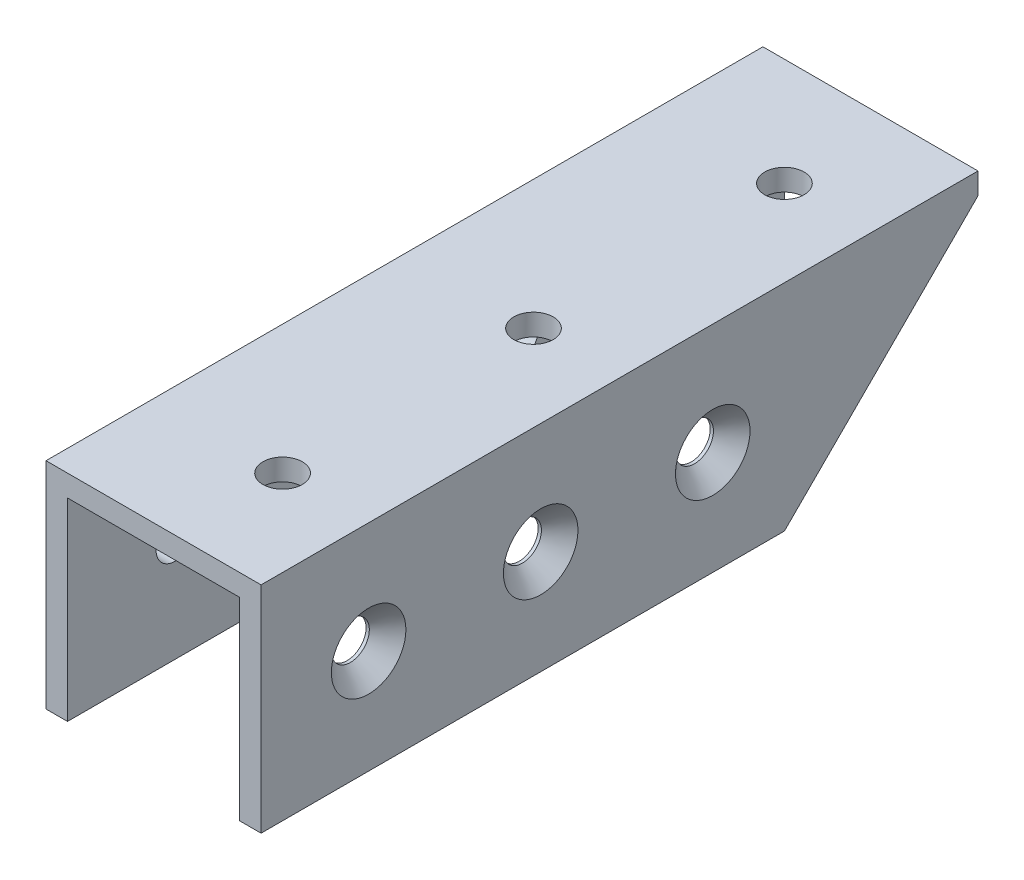
ISO-10303-21;
HEADER;
FILE_DESCRIPTION(('STEP AP214'),'2;1');
FILE_NAME('part.step','',(''),(''),'','','');
FILE_SCHEMA(('AUTOMOTIVE_DESIGN { 1 0 10303 214 1 1 1 1 }'));
ENDSEC;
DATA;
#1=APPLICATION_CONTEXT('core data for automotive mechanical design processes');
#2=APPLICATION_PROTOCOL_DEFINITION('international standard','automotive_design',2000,#1);
#3=PRODUCT_CONTEXT('',#1,'mechanical');
#4=PRODUCT('Part','Part','',(#3));
#5=PRODUCT_RELATED_PRODUCT_CATEGORY('part','',(#4));
#6=PRODUCT_DEFINITION_FORMATION('','',#4);
#7=PRODUCT_DEFINITION_CONTEXT('part definition',#1,'design');
#8=PRODUCT_DEFINITION('design','',#6,#7);
#9=PRODUCT_DEFINITION_SHAPE('','',#8);
#10=(LENGTH_UNIT() NAMED_UNIT(*) SI_UNIT(.MILLI.,.METRE.));
#11=(NAMED_UNIT(*) PLANE_ANGLE_UNIT() SI_UNIT($,.RADIAN.));
#12=(NAMED_UNIT(*) SI_UNIT($,.STERADIAN.) SOLID_ANGLE_UNIT());
#13=UNCERTAINTY_MEASURE_WITH_UNIT(LENGTH_MEASURE(1.E-05),#10,'distance_accuracy_value','');
#14=(GEOMETRIC_REPRESENTATION_CONTEXT(3) GLOBAL_UNCERTAINTY_ASSIGNED_CONTEXT((#13)) GLOBAL_UNIT_ASSIGNED_CONTEXT((#10,
#11,#12)) REPRESENTATION_CONTEXT('',''));
#15=CARTESIAN_POINT('',(0.,0.,0.));
#16=DIRECTION('',(0.,0.,1.));
#17=DIRECTION('',(1.,0.,0.));
#18=AXIS2_PLACEMENT_3D('',#15,#16,#17);
#19=CARTESIAN_POINT('',(3.,0.,100.));
#20=DIRECTION('',(0.,1.,0.));
#21=DIRECTION('',(-1.,0.,0.));
#22=AXIS2_PLACEMENT_3D('',#19,#20,#21);
#23=PLANE('',#22);
#24=DIRECTION('',(1.,0.,0.));
#25=VECTOR('',#24,1.);
#26=CARTESIAN_POINT('',(3.,0.,0.));
#27=LINE('',#26,#25);
#28=CARTESIAN_POINT('',(0.,0.,0.));
#29=VERTEX_POINT('',#28);
#30=CARTESIAN_POINT('',(3.,0.,0.));
#31=VERTEX_POINT('',#30);
#32=EDGE_CURVE('E128',#29,#31,#27,.T.);
#33=ORIENTED_EDGE('',*,*,#32,.T.);
#34=DIRECTION('',(0.,0.,-1.));
#35=VECTOR('',#34,1.);
#36=CARTESIAN_POINT('',(3.,0.,100.));
#37=LINE('',#36,#35);
#38=CARTESIAN_POINT('',(3.,0.,100.));
#39=VERTEX_POINT('',#38);
#40=EDGE_CURVE('E109',#39,#31,#37,.T.);
#41=ORIENTED_EDGE('',*,*,#40,.F.);
#42=DIRECTION('',(1.,0.,0.));
#43=VECTOR('',#42,1.);
#44=CARTESIAN_POINT('',(3.,0.,100.));
#45=LINE('',#44,#43);
#46=CARTESIAN_POINT('',(0.,0.,100.));
#47=VERTEX_POINT('',#46);
#48=EDGE_CURVE('E116',#47,#39,#45,.T.);
#49=ORIENTED_EDGE('',*,*,#48,.F.);
#50=DIRECTION('',(0.,0.,-1.));
#51=VECTOR('',#50,1.);
#52=CARTESIAN_POINT('',(0.,0.,100.));
#53=LINE('',#52,#51);
#54=EDGE_CURVE('E174',#47,#29,#53,.T.);
#55=ORIENTED_EDGE('',*,*,#54,.T.);
#56=EDGE_LOOP('',(#33,#41,#49,#55));
#57=FACE_BOUND('',#56,.T.);
#58=ADVANCED_FACE('F36',(#57),#23,.F.);
#59=CARTESIAN_POINT('',(3.,27.,100.));
#60=DIRECTION('',(-1.,0.,0.));
#61=DIRECTION('',(0.,-1.,0.));
#62=AXIS2_PLACEMENT_3D('',#59,#60,#61);
#63=PLANE('',#62);
#64=CARTESIAN_POINT('',(3.,14.5,37.));
#65=DIRECTION('',(-1.,0.,0.));
#66=DIRECTION('',(0.,-1.,0.));
#67=AXIS2_PLACEMENT_3D('',#64,#65,#66);
#68=CIRCLE('',#67,2.64999999999999);
#69=CARTESIAN_POINT('',(3.,11.85,37.));
#70=VERTEX_POINT('',#69);
#71=EDGE_CURVE('E238',#70,#70,#68,.T.);
#72=ORIENTED_EDGE('',*,*,#71,.T.);
#73=EDGE_LOOP('',(#72));
#74=FACE_BOUND('',#73,.T.);
#75=CARTESIAN_POINT('',(3.,14.5,85.));
#76=DIRECTION('',(-1.,0.,0.));
#77=DIRECTION('',(0.,-1.,0.));
#78=AXIS2_PLACEMENT_3D('',#75,#76,#77);
#79=CIRCLE('',#78,2.64999999999999);
#80=CARTESIAN_POINT('',(3.,11.85,85.));
#81=VERTEX_POINT('',#80);
#82=EDGE_CURVE('E223',#81,#81,#79,.T.);
#83=ORIENTED_EDGE('',*,*,#82,.T.);
#84=EDGE_LOOP('',(#83));
#85=FACE_BOUND('',#84,.T.);
#86=CARTESIAN_POINT('',(3.,14.5,61.));
#87=DIRECTION('',(-1.,0.,0.));
#88=DIRECTION('',(0.,-1.,0.));
#89=AXIS2_PLACEMENT_3D('',#86,#87,#88);
#90=CIRCLE('',#89,2.64999999999999);
#91=CARTESIAN_POINT('',(3.,11.85,61.));
#92=VERTEX_POINT('',#91);
#93=EDGE_CURVE('E208',#92,#92,#90,.T.);
#94=ORIENTED_EDGE('',*,*,#93,.T.);
#95=EDGE_LOOP('',(#94));
#96=FACE_BOUND('',#95,.T.);
#97=DIRECTION('',(0.,1.,0.));
#98=VECTOR('',#97,1.);
#99=CARTESIAN_POINT('',(3.,27.,0.));
#100=LINE('',#99,#98);
#101=CARTESIAN_POINT('',(3.,27.,0.));
#102=VERTEX_POINT('',#101);
#103=EDGE_CURVE('E150',#31,#102,#100,.T.);
#104=ORIENTED_EDGE('',*,*,#103,.T.);
#105=DIRECTION('',(0.,0.,-1.));
#106=VECTOR('',#105,1.);
#107=CARTESIAN_POINT('',(3.,27.,100.));
#108=LINE('',#107,#106);
#109=CARTESIAN_POINT('',(3.,27.,100.));
#110=VERTEX_POINT('',#109);
#111=EDGE_CURVE('E112',#110,#102,#108,.T.);
#112=ORIENTED_EDGE('',*,*,#111,.F.);
#113=DIRECTION('',(0.,1.,0.));
#114=VECTOR('',#113,1.);
#115=CARTESIAN_POINT('',(3.,27.,100.));
#116=LINE('',#115,#114);
#117=EDGE_CURVE('E105',#39,#110,#116,.T.);
#118=ORIENTED_EDGE('',*,*,#117,.F.);
#119=ORIENTED_EDGE('',*,*,#40,.T.);
#120=EDGE_LOOP('',(#104,#112,#118,#119));
#121=FACE_BOUND('',#120,.T.);
#122=ADVANCED_FACE('F107',(#74,#85,#96,#121),#63,.F.);
#123=CARTESIAN_POINT('',(27.,27.,100.));
#124=DIRECTION('',(0.,1.,0.));
#125=DIRECTION('',(-1.,0.,0.));
#126=AXIS2_PLACEMENT_3D('',#123,#124,#125);
#127=PLANE('',#126);
#128=CARTESIAN_POINT('',(18.,27.,50.));
#129=DIRECTION('',(0.,1.,0.));
#130=DIRECTION('',(-1.,0.,0.));
#131=AXIS2_PLACEMENT_3D('',#128,#129,#130);
#132=CIRCLE('',#131,2.74999999999999);
#133=CARTESIAN_POINT('',(15.25,27.,50.));
#134=VERTEX_POINT('',#133);
#135=EDGE_CURVE('E202',#134,#134,#132,.T.);
#136=ORIENTED_EDGE('',*,*,#135,.T.);
#137=EDGE_LOOP('',(#136));
#138=FACE_BOUND('',#137,.T.);
#139=CARTESIAN_POINT('',(18.,27.,15.));
#140=DIRECTION('',(0.,1.,0.));
#141=DIRECTION('',(-1.,0.,0.));
#142=AXIS2_PLACEMENT_3D('',#139,#140,#141);
#143=CIRCLE('',#142,2.74999999999999);
#144=CARTESIAN_POINT('',(15.25,27.,15.));
#145=VERTEX_POINT('',#144);
#146=EDGE_CURVE('E196',#145,#145,#143,.T.);
#147=ORIENTED_EDGE('',*,*,#146,.T.);
#148=EDGE_LOOP('',(#147));
#149=FACE_BOUND('',#148,.T.);
#150=CARTESIAN_POINT('',(18.,27.,85.));
#151=DIRECTION('',(0.,1.,0.));
#152=DIRECTION('',(-1.,0.,0.));
#153=AXIS2_PLACEMENT_3D('',#150,#151,#152);
#154=CIRCLE('',#153,2.74999999999999);
#155=CARTESIAN_POINT('',(15.25,27.,85.));
#156=VERTEX_POINT('',#155);
#157=EDGE_CURVE('E182',#156,#156,#154,.T.);
#158=ORIENTED_EDGE('',*,*,#157,.T.);
#159=EDGE_LOOP('',(#158));
#160=FACE_BOUND('',#159,.T.);
#161=DIRECTION('',(1.,0.,0.));
#162=VECTOR('',#161,1.);
#163=CARTESIAN_POINT('',(27.,27.,0.));
#164=LINE('',#163,#162);
#165=CARTESIAN_POINT('',(27.,27.,0.));
#166=VERTEX_POINT('',#165);
#167=EDGE_CURVE('E142',#102,#166,#164,.T.);
#168=ORIENTED_EDGE('',*,*,#167,.T.);
#169=DIRECTION('',(0.,0.,-1.));
#170=VECTOR('',#169,1.);
#171=CARTESIAN_POINT('',(27.,27.,100.));
#172=LINE('',#171,#170);
#173=CARTESIAN_POINT('',(27.,27.,100.));
#174=VERTEX_POINT('',#173);
#175=EDGE_CURVE('E133',#174,#166,#172,.T.);
#176=ORIENTED_EDGE('',*,*,#175,.F.);
#177=DIRECTION('',(1.,0.,0.));
#178=VECTOR('',#177,1.);
#179=CARTESIAN_POINT('',(27.,27.,100.));
#180=LINE('',#179,#178);
#181=EDGE_CURVE('E115',#110,#174,#180,.T.);
#182=ORIENTED_EDGE('',*,*,#181,.F.);
#183=ORIENTED_EDGE('',*,*,#111,.T.);
#184=EDGE_LOOP('',(#168,#176,#182,#183));
#185=FACE_BOUND('',#184,.T.);
#186=ADVANCED_FACE('F148',(#138,#149,#160,#185),#127,.F.);
#187=CARTESIAN_POINT('',(27.,0.,100.));
#188=DIRECTION('',(1.,0.,0.));
#189=DIRECTION('',(0.,0.,-1.));
#190=AXIS2_PLACEMENT_3D('',#187,#188,#189);
#191=PLANE('',#190);
#192=CARTESIAN_POINT('',(27.,14.5,37.));
#193=DIRECTION('',(1.,0.,0.));
#194=DIRECTION('',(0.,0.,-1.));
#195=AXIS2_PLACEMENT_3D('',#192,#193,#194);
#196=CIRCLE('',#195,2.64999999999999);
#197=CARTESIAN_POINT('',(27.,14.5,34.35));
#198=VERTEX_POINT('',#197);
#199=EDGE_CURVE('E241',#198,#198,#196,.T.);
#200=ORIENTED_EDGE('',*,*,#199,.T.);
#201=EDGE_LOOP('',(#200));
#202=FACE_BOUND('',#201,.T.);
#203=CARTESIAN_POINT('',(27.,14.5,85.));
#204=DIRECTION('',(1.,0.,0.));
#205=DIRECTION('',(0.,0.,-1.));
#206=AXIS2_PLACEMENT_3D('',#203,#204,#205);
#207=CIRCLE('',#206,2.64999999999999);
#208=CARTESIAN_POINT('',(27.,14.5,82.35));
#209=VERTEX_POINT('',#208);
#210=EDGE_CURVE('E226',#209,#209,#207,.T.);
#211=ORIENTED_EDGE('',*,*,#210,.T.);
#212=EDGE_LOOP('',(#211));
#213=FACE_BOUND('',#212,.T.);
#214=CARTESIAN_POINT('',(27.,14.5,61.));
#215=DIRECTION('',(1.,0.,0.));
#216=DIRECTION('',(0.,0.,-1.));
#217=AXIS2_PLACEMENT_3D('',#214,#215,#216);
#218=CIRCLE('',#217,2.64999999999999);
#219=CARTESIAN_POINT('',(27.,14.5,58.35));
#220=VERTEX_POINT('',#219);
#221=EDGE_CURVE('E211',#220,#220,#218,.T.);
#222=ORIENTED_EDGE('',*,*,#221,.T.);
#223=EDGE_LOOP('',(#222));
#224=FACE_BOUND('',#223,.T.);
#225=ORIENTED_EDGE('',*,*,#175,.T.);
#226=DIRECTION('',(0.,-0.707106781186549,0.707106781186546));
#227=VECTOR('',#226,1.);
#228=CARTESIAN_POINT('',(27.,0.,27.));
#229=LINE('',#228,#227);
#230=CARTESIAN_POINT('',(27.,0.,27.));
#231=VERTEX_POINT('',#230);
#232=EDGE_CURVE('E11',#166,#231,#229,.T.);
#233=ORIENTED_EDGE('',*,*,#232,.T.);
#234=DIRECTION('',(0.,0.,-1.));
#235=VECTOR('',#234,1.);
#236=CARTESIAN_POINT('',(27.,0.,100.));
#237=LINE('',#236,#235);
#238=CARTESIAN_POINT('',(27.,0.,100.));
#239=VERTEX_POINT('',#238);
#240=EDGE_CURVE('E154',#239,#231,#237,.T.);
#241=ORIENTED_EDGE('',*,*,#240,.F.);
#242=DIRECTION('',(0.,-1.,0.));
#243=VECTOR('',#242,1.);
#244=CARTESIAN_POINT('',(27.,0.,100.));
#245=LINE('',#244,#243);
#246=EDGE_CURVE('E153',#174,#239,#245,.T.);
#247=ORIENTED_EDGE('',*,*,#246,.F.);
#248=EDGE_LOOP('',(#225,#233,#241,#247));
#249=FACE_BOUND('',#248,.T.);
#250=ADVANCED_FACE('F152',(#202,#213,#224,#249),#191,.F.);
#251=CARTESIAN_POINT('',(30.,0.,100.));
#252=DIRECTION('',(0.,1.,0.));
#253=DIRECTION('',(-1.,0.,0.));
#254=AXIS2_PLACEMENT_3D('',#251,#252,#253);
#255=PLANE('',#254);
#256=ORIENTED_EDGE('',*,*,#240,.T.);
#257=DIRECTION('',(1.,0.,0.));
#258=VECTOR('',#257,1.);
#259=CARTESIAN_POINT('',(30.,0.,27.));
#260=LINE('',#259,#258);
#261=CARTESIAN_POINT('',(30.,0.,27.));
#262=VERTEX_POINT('',#261);
#263=EDGE_CURVE('E129',#231,#262,#260,.T.);
#264=ORIENTED_EDGE('',*,*,#263,.T.);
#265=DIRECTION('',(0.,0.,-1.));
#266=VECTOR('',#265,1.);
#267=CARTESIAN_POINT('',(30.,0.,100.));
#268=LINE('',#267,#266);
#269=CARTESIAN_POINT('',(30.,0.,100.));
#270=VERTEX_POINT('',#269);
#271=EDGE_CURVE('E160',#270,#262,#268,.T.);
#272=ORIENTED_EDGE('',*,*,#271,.F.);
#273=DIRECTION('',(1.,0.,0.));
#274=VECTOR('',#273,1.);
#275=CARTESIAN_POINT('',(30.,0.,100.));
#276=LINE('',#275,#274);
#277=EDGE_CURVE('E187',#239,#270,#276,.T.);
#278=ORIENTED_EDGE('',*,*,#277,.F.);
#279=EDGE_LOOP('',(#256,#264,#272,#278));
#280=FACE_BOUND('',#279,.T.);
#281=ADVANCED_FACE('F158',(#280),#255,.F.);
#282=CARTESIAN_POINT('',(30.,30.,100.));
#283=DIRECTION('',(-1.,0.,0.));
#284=DIRECTION('',(0.,-1.,0.));
#285=AXIS2_PLACEMENT_3D('',#282,#283,#284);
#286=PLANE('',#285);
#287=CARTESIAN_POINT('',(30.,14.5,37.));
#288=DIRECTION('',(1.,0.,0.));
#289=DIRECTION('',(0.,0.,-1.));
#290=AXIS2_PLACEMENT_3D('',#287,#288,#289);
#291=CIRCLE('',#290,5.2);
#292=CARTESIAN_POINT('',(30.,14.5,31.8));
#293=VERTEX_POINT('',#292);
#294=EDGE_CURVE('E250',#293,#293,#291,.T.);
#295=ORIENTED_EDGE('',*,*,#294,.F.);
#296=EDGE_LOOP('',(#295));
#297=FACE_BOUND('',#296,.T.);
#298=CARTESIAN_POINT('',(30.,14.5,85.));
#299=DIRECTION('',(1.,0.,0.));
#300=DIRECTION('',(0.,0.,-1.));
#301=AXIS2_PLACEMENT_3D('',#298,#299,#300);
#302=CIRCLE('',#301,5.2);
#303=CARTESIAN_POINT('',(30.,14.5,79.8));
#304=VERTEX_POINT('',#303);
#305=EDGE_CURVE('E235',#304,#304,#302,.T.);
#306=ORIENTED_EDGE('',*,*,#305,.F.);
#307=EDGE_LOOP('',(#306));
#308=FACE_BOUND('',#307,.T.);
#309=CARTESIAN_POINT('',(30.,14.5,61.));
#310=DIRECTION('',(1.,0.,0.));
#311=DIRECTION('',(0.,0.,-1.));
#312=AXIS2_PLACEMENT_3D('',#309,#310,#311);
#313=CIRCLE('',#312,5.2);
#314=CARTESIAN_POINT('',(30.,14.5,55.8));
#315=VERTEX_POINT('',#314);
#316=EDGE_CURVE('E220',#315,#315,#313,.T.);
#317=ORIENTED_EDGE('',*,*,#316,.F.);
#318=EDGE_LOOP('',(#317));
#319=FACE_BOUND('',#318,.T.);
#320=ORIENTED_EDGE('',*,*,#271,.T.);
#321=DIRECTION('',(0.,0.707106781186549,-0.707106781186546));
#322=VECTOR('',#321,1.);
#323=CARTESIAN_POINT('',(30.,0.,27.));
#324=LINE('',#323,#322);
#325=CARTESIAN_POINT('',(30.,27.0000000000001,0.));
#326=VERTEX_POINT('',#325);
#327=EDGE_CURVE('E52',#262,#326,#324,.T.);
#328=ORIENTED_EDGE('',*,*,#327,.T.);
#329=DIRECTION('',(0.,1.,0.));
#330=VECTOR('',#329,1.);
#331=CARTESIAN_POINT('',(30.,30.,0.));
#332=LINE('',#331,#330);
#333=CARTESIAN_POINT('',(30.,30.,0.));
#334=VERTEX_POINT('',#333);
#335=EDGE_CURVE('E144',#326,#334,#332,.T.);
#336=ORIENTED_EDGE('',*,*,#335,.T.);
#337=DIRECTION('',(0.,0.,-1.));
#338=VECTOR('',#337,1.);
#339=CARTESIAN_POINT('',(30.,30.,100.));
#340=LINE('',#339,#338);
#341=CARTESIAN_POINT('',(30.,30.,100.));
#342=VERTEX_POINT('',#341);
#343=EDGE_CURVE('E165',#342,#334,#340,.T.);
#344=ORIENTED_EDGE('',*,*,#343,.F.);
#345=DIRECTION('',(0.,1.,0.));
#346=VECTOR('',#345,1.);
#347=CARTESIAN_POINT('',(30.,30.,100.));
#348=LINE('',#347,#346);
#349=EDGE_CURVE('E164',#270,#342,#348,.T.);
#350=ORIENTED_EDGE('',*,*,#349,.F.);
#351=EDGE_LOOP('',(#320,#328,#336,#344,#350));
#352=FACE_BOUND('',#351,.T.);
#353=ADVANCED_FACE('F162',(#297,#308,#319,#352),#286,.F.);
#354=CARTESIAN_POINT('',(0.,30.,100.));
#355=DIRECTION('',(0.,-1.,0.));
#356=DIRECTION('',(0.,0.,-1.));
#357=AXIS2_PLACEMENT_3D('',#354,#355,#356);
#358=PLANE('',#357);
#359=CARTESIAN_POINT('',(18.,30.,50.));
#360=DIRECTION('',(0.,1.,0.));
#361=DIRECTION('',(0.,0.,1.));
#362=AXIS2_PLACEMENT_3D('',#359,#360,#361);
#363=CIRCLE('',#362,2.74999999999999);
#364=CARTESIAN_POINT('',(18.,30.,52.75));
#365=VERTEX_POINT('',#364);
#366=EDGE_CURVE('E205',#365,#365,#363,.T.);
#367=ORIENTED_EDGE('',*,*,#366,.F.);
#368=EDGE_LOOP('',(#367));
#369=FACE_BOUND('',#368,.T.);
#370=CARTESIAN_POINT('',(18.,30.,15.));
#371=DIRECTION('',(0.,1.,0.));
#372=DIRECTION('',(0.,0.,1.));
#373=AXIS2_PLACEMENT_3D('',#370,#371,#372);
#374=CIRCLE('',#373,2.74999999999999);
#375=CARTESIAN_POINT('',(18.,30.,17.75));
#376=VERTEX_POINT('',#375);
#377=EDGE_CURVE('E199',#376,#376,#374,.T.);
#378=ORIENTED_EDGE('',*,*,#377,.F.);
#379=EDGE_LOOP('',(#378));
#380=FACE_BOUND('',#379,.T.);
#381=CARTESIAN_POINT('',(18.,30.,85.));
#382=DIRECTION('',(0.,1.,0.));
#383=DIRECTION('',(0.,0.,1.));
#384=AXIS2_PLACEMENT_3D('',#381,#382,#383);
#385=CIRCLE('',#384,2.74999999999999);
#386=CARTESIAN_POINT('',(18.,30.,87.75));
#387=VERTEX_POINT('',#386);
#388=EDGE_CURVE('E193',#387,#387,#385,.T.);
#389=ORIENTED_EDGE('',*,*,#388,.F.);
#390=EDGE_LOOP('',(#389));
#391=FACE_BOUND('',#390,.T.);
#392=DIRECTION('',(-1.,0.,0.));
#393=VECTOR('',#392,1.);
#394=CARTESIAN_POINT('',(0.,30.,0.));
#395=LINE('',#394,#393);
#396=CARTESIAN_POINT('',(0.,30.,0.));
#397=VERTEX_POINT('',#396);
#398=EDGE_CURVE('E177',#334,#397,#395,.T.);
#399=ORIENTED_EDGE('',*,*,#398,.T.);
#400=DIRECTION('',(0.,0.,-1.));
#401=VECTOR('',#400,1.);
#402=CARTESIAN_POINT('',(0.,30.,100.));
#403=LINE('',#402,#401);
#404=CARTESIAN_POINT('',(0.,30.,100.));
#405=VERTEX_POINT('',#404);
#406=EDGE_CURVE('E169',#405,#397,#403,.T.);
#407=ORIENTED_EDGE('',*,*,#406,.F.);
#408=DIRECTION('',(-1.,0.,0.));
#409=VECTOR('',#408,1.);
#410=CARTESIAN_POINT('',(0.,30.,100.));
#411=LINE('',#410,#409);
#412=EDGE_CURVE('E184',#342,#405,#411,.T.);
#413=ORIENTED_EDGE('',*,*,#412,.F.);
#414=ORIENTED_EDGE('',*,*,#343,.T.);
#415=EDGE_LOOP('',(#399,#407,#413,#414));
#416=FACE_BOUND('',#415,.T.);
#417=ADVANCED_FACE('F258',(#369,#380,#391,#416),#358,.F.);
#418=CARTESIAN_POINT('',(0.,0.,100.));
#419=DIRECTION('',(1.,0.,0.));
#420=DIRECTION('',(0.,0.,-1.));
#421=AXIS2_PLACEMENT_3D('',#418,#419,#420);
#422=PLANE('',#421);
#423=CARTESIAN_POINT('',(0.,14.5,37.));
#424=DIRECTION('',(1.,0.,0.));
#425=DIRECTION('',(0.,0.,-1.));
#426=AXIS2_PLACEMENT_3D('',#423,#424,#425);
#427=CIRCLE('',#426,2.64999999999999);
#428=CARTESIAN_POINT('',(0.,14.5,34.35));
#429=VERTEX_POINT('',#428);
#430=EDGE_CURVE('E244',#429,#429,#427,.T.);
#431=ORIENTED_EDGE('',*,*,#430,.T.);
#432=EDGE_LOOP('',(#431));
#433=FACE_BOUND('',#432,.T.);
#434=CARTESIAN_POINT('',(0.,14.5,85.));
#435=DIRECTION('',(1.,0.,0.));
#436=DIRECTION('',(0.,0.,-1.));
#437=AXIS2_PLACEMENT_3D('',#434,#435,#436);
#438=CIRCLE('',#437,2.64999999999999);
#439=CARTESIAN_POINT('',(0.,14.5,82.35));
#440=VERTEX_POINT('',#439);
#441=EDGE_CURVE('E229',#440,#440,#438,.T.);
#442=ORIENTED_EDGE('',*,*,#441,.T.);
#443=EDGE_LOOP('',(#442));
#444=FACE_BOUND('',#443,.T.);
#445=CARTESIAN_POINT('',(0.,14.5,61.));
#446=DIRECTION('',(1.,0.,0.));
#447=DIRECTION('',(0.,0.,-1.));
#448=AXIS2_PLACEMENT_3D('',#445,#446,#447);
#449=CIRCLE('',#448,2.64999999999999);
#450=CARTESIAN_POINT('',(0.,14.5,58.35));
#451=VERTEX_POINT('',#450);
#452=EDGE_CURVE('E214',#451,#451,#449,.T.);
#453=ORIENTED_EDGE('',*,*,#452,.T.);
#454=EDGE_LOOP('',(#453));
#455=FACE_BOUND('',#454,.T.);
#456=DIRECTION('',(0.,-1.,0.));
#457=VECTOR('',#456,1.);
#458=CARTESIAN_POINT('',(0.,0.,0.));
#459=LINE('',#458,#457);
#460=EDGE_CURVE('E125',#397,#29,#459,.T.);
#461=ORIENTED_EDGE('',*,*,#460,.T.);
#462=ORIENTED_EDGE('',*,*,#54,.F.);
#463=DIRECTION('',(0.,-1.,0.));
#464=VECTOR('',#463,1.);
#465=CARTESIAN_POINT('',(0.,0.,100.));
#466=LINE('',#465,#464);
#467=EDGE_CURVE('E121',#405,#47,#466,.T.);
#468=ORIENTED_EDGE('',*,*,#467,.F.);
#469=ORIENTED_EDGE('',*,*,#406,.T.);
#470=EDGE_LOOP('',(#461,#462,#468,#469));
#471=FACE_BOUND('',#470,.T.);
#472=ADVANCED_FACE('F298',(#433,#444,#455,#471),#422,.F.);
#473=CARTESIAN_POINT('',(0.,0.,100.));
#474=DIRECTION('',(0.,0.,-1.));
#475=DIRECTION('',(-1.,0.,0.));
#476=AXIS2_PLACEMENT_3D('',#473,#474,#475);
#477=PLANE('',#476);
#478=ORIENTED_EDGE('',*,*,#48,.T.);
#479=ORIENTED_EDGE('',*,*,#117,.T.);
#480=ORIENTED_EDGE('',*,*,#181,.T.);
#481=ORIENTED_EDGE('',*,*,#246,.T.);
#482=ORIENTED_EDGE('',*,*,#277,.T.);
#483=ORIENTED_EDGE('',*,*,#349,.T.);
#484=ORIENTED_EDGE('',*,*,#412,.T.);
#485=ORIENTED_EDGE('',*,*,#467,.T.);
#486=EDGE_LOOP('',(#478,#479,#480,#481,#482,#483,#484,#485));
#487=FACE_BOUND('',#486,.T.);
#488=ADVANCED_FACE('F119',(#487),#477,.F.);
#489=CARTESIAN_POINT('',(0.,0.,0.));
#490=DIRECTION('',(0.,0.,-1.));
#491=DIRECTION('',(-1.,0.,0.));
#492=AXIS2_PLACEMENT_3D('',#489,#490,#491);
#493=PLANE('',#492);
#494=ORIENTED_EDGE('',*,*,#335,.F.);
#495=DIRECTION('',(-1.,0.,0.));
#496=VECTOR('',#495,1.);
#497=CARTESIAN_POINT('',(27.,27.0000000000001,0.));
#498=LINE('',#497,#496);
#499=EDGE_CURVE('E45',#326,#166,#498,.T.);
#500=ORIENTED_EDGE('',*,*,#499,.T.);
#501=ORIENTED_EDGE('',*,*,#167,.F.);
#502=ORIENTED_EDGE('',*,*,#103,.F.);
#503=ORIENTED_EDGE('',*,*,#32,.F.);
#504=ORIENTED_EDGE('',*,*,#460,.F.);
#505=ORIENTED_EDGE('',*,*,#398,.F.);
#506=EDGE_LOOP('',(#494,#500,#501,#502,#503,#504,#505));
#507=FACE_BOUND('',#506,.T.);
#508=ADVANCED_FACE('F141',(#507),#493,.T.);
#509=CARTESIAN_POINT('',(18.,30.,85.));
#510=DIRECTION('',(0.,1.,0.));
#511=DIRECTION('',(0.,0.,1.));
#512=AXIS2_PLACEMENT_3D('',#509,#510,#511);
#513=CYLINDRICAL_SURFACE('',#512,2.74999999999999);
#514=ORIENTED_EDGE('',*,*,#388,.T.);
#515=EDGE_LOOP('',(#514));
#516=FACE_BOUND('',#515,.T.);
#517=ORIENTED_EDGE('',*,*,#157,.F.);
#518=EDGE_LOOP('',(#517));
#519=FACE_BOUND('',#518,.T.);
#520=ADVANCED_FACE('F305',(#516,#519),#513,.F.);
#521=CARTESIAN_POINT('',(18.,30.,15.));
#522=DIRECTION('',(0.,1.,0.));
#523=DIRECTION('',(0.,0.,1.));
#524=AXIS2_PLACEMENT_3D('',#521,#522,#523);
#525=CYLINDRICAL_SURFACE('',#524,2.74999999999999);
#526=ORIENTED_EDGE('',*,*,#377,.T.);
#527=EDGE_LOOP('',(#526));
#528=FACE_BOUND('',#527,.T.);
#529=ORIENTED_EDGE('',*,*,#146,.F.);
#530=EDGE_LOOP('',(#529));
#531=FACE_BOUND('',#530,.T.);
#532=ADVANCED_FACE('F310',(#528,#531),#525,.F.);
#533=CARTESIAN_POINT('',(18.,30.,50.));
#534=DIRECTION('',(0.,1.,0.));
#535=DIRECTION('',(0.,0.,1.));
#536=AXIS2_PLACEMENT_3D('',#533,#534,#535);
#537=CYLINDRICAL_SURFACE('',#536,2.74999999999999);
#538=ORIENTED_EDGE('',*,*,#366,.T.);
#539=EDGE_LOOP('',(#538));
#540=FACE_BOUND('',#539,.T.);
#541=ORIENTED_EDGE('',*,*,#135,.F.);
#542=EDGE_LOOP('',(#541));
#543=FACE_BOUND('',#542,.T.);
#544=ADVANCED_FACE('F314',(#540,#543),#537,.F.);
#545=CARTESIAN_POINT('',(30.,14.5,61.));
#546=DIRECTION('',(1.,0.,0.));
#547=DIRECTION('',(0.,0.,-1.));
#548=AXIS2_PLACEMENT_3D('',#545,#546,#547);
#549=CYLINDRICAL_SURFACE('',#548,2.64999999999999);
#550=ORIENTED_EDGE('',*,*,#452,.F.);
#551=EDGE_LOOP('',(#550));
#552=FACE_BOUND('',#551,.T.);
#553=ORIENTED_EDGE('',*,*,#93,.F.);
#554=EDGE_LOOP('',(#553));
#555=FACE_BOUND('',#554,.T.);
#556=ADVANCED_FACE('F277',(#552,#555),#549,.F.);
#557=CARTESIAN_POINT('',(27.45,14.5,61.));
#558=DIRECTION('',(1.,0.,0.));
#559=DIRECTION('',(0.,0.,-1.));
#560=AXIS2_PLACEMENT_3D('',#557,#558,#559);
#561=CIRCLE('',#560,2.65);
#562=CARTESIAN_POINT('',(27.45,14.5,58.35));
#563=VERTEX_POINT('',#562);
#564=EDGE_CURVE('E217',#563,#563,#561,.T.);
#565=ORIENTED_EDGE('',*,*,#564,.T.);
#566=EDGE_LOOP('',(#565));
#567=FACE_BOUND('',#566,.T.);
#568=ORIENTED_EDGE('',*,*,#221,.F.);
#569=EDGE_LOOP('',(#568));
#570=FACE_BOUND('',#569,.T.);
#571=ADVANCED_FACE('F267',(#567,#570),#549,.F.);
#572=CARTESIAN_POINT('',(30.,14.5,61.));
#573=DIRECTION('',(1.,0.,0.));
#574=DIRECTION('',(0.,0.,-1.));
#575=AXIS2_PLACEMENT_3D('',#572,#573,#574);
#576=CONICAL_SURFACE('',#575,5.2,0.785398163397447);
#577=ORIENTED_EDGE('',*,*,#564,.F.);
#578=EDGE_LOOP('',(#577));
#579=FACE_BOUND('',#578,.T.);
#580=ORIENTED_EDGE('',*,*,#316,.T.);
#581=EDGE_LOOP('',(#580));
#582=FACE_BOUND('',#581,.T.);
#583=ADVANCED_FACE('F264',(#579,#582),#576,.F.);
#584=CARTESIAN_POINT('',(30.,14.5,85.));
#585=DIRECTION('',(1.,0.,0.));
#586=DIRECTION('',(0.,0.,-1.));
#587=AXIS2_PLACEMENT_3D('',#584,#585,#586);
#588=CYLINDRICAL_SURFACE('',#587,2.64999999999999);
#589=ORIENTED_EDGE('',*,*,#441,.F.);
#590=EDGE_LOOP('',(#589));
#591=FACE_BOUND('',#590,.T.);
#592=ORIENTED_EDGE('',*,*,#82,.F.);
#593=EDGE_LOOP('',(#592));
#594=FACE_BOUND('',#593,.T.);
#595=ADVANCED_FACE('F266',(#591,#594),#588,.F.);
#596=CARTESIAN_POINT('',(27.45,14.5,85.));
#597=DIRECTION('',(1.,0.,0.));
#598=DIRECTION('',(0.,0.,-1.));
#599=AXIS2_PLACEMENT_3D('',#596,#597,#598);
#600=CIRCLE('',#599,2.65);
#601=CARTESIAN_POINT('',(27.45,14.5,82.35));
#602=VERTEX_POINT('',#601);
#603=EDGE_CURVE('E232',#602,#602,#600,.T.);
#604=ORIENTED_EDGE('',*,*,#603,.T.);
#605=EDGE_LOOP('',(#604));
#606=FACE_BOUND('',#605,.T.);
#607=ORIENTED_EDGE('',*,*,#210,.F.);
#608=EDGE_LOOP('',(#607));
#609=FACE_BOUND('',#608,.T.);
#610=ADVANCED_FACE('F274',(#606,#609),#588,.F.);
#611=CARTESIAN_POINT('',(30.,14.5,85.));
#612=DIRECTION('',(1.,0.,0.));
#613=DIRECTION('',(0.,0.,-1.));
#614=AXIS2_PLACEMENT_3D('',#611,#612,#613);
#615=CONICAL_SURFACE('',#614,5.2,0.785398163397447);
#616=ORIENTED_EDGE('',*,*,#603,.F.);
#617=EDGE_LOOP('',(#616));
#618=FACE_BOUND('',#617,.T.);
#619=ORIENTED_EDGE('',*,*,#305,.T.);
#620=EDGE_LOOP('',(#619));
#621=FACE_BOUND('',#620,.T.);
#622=ADVANCED_FACE('F358',(#618,#621),#615,.F.);
#623=CARTESIAN_POINT('',(30.,14.5,37.));
#624=DIRECTION('',(1.,0.,0.));
#625=DIRECTION('',(0.,0.,-1.));
#626=AXIS2_PLACEMENT_3D('',#623,#624,#625);
#627=CYLINDRICAL_SURFACE('',#626,2.64999999999999);
#628=ORIENTED_EDGE('',*,*,#430,.F.);
#629=EDGE_LOOP('',(#628));
#630=FACE_BOUND('',#629,.T.);
#631=ORIENTED_EDGE('',*,*,#71,.F.);
#632=EDGE_LOOP('',(#631));
#633=FACE_BOUND('',#632,.T.);
#634=ADVANCED_FACE('F367',(#630,#633),#627,.F.);
#635=CARTESIAN_POINT('',(27.45,14.5,37.));
#636=DIRECTION('',(1.,0.,0.));
#637=DIRECTION('',(0.,0.,-1.));
#638=AXIS2_PLACEMENT_3D('',#635,#636,#637);
#639=CIRCLE('',#638,2.65);
#640=CARTESIAN_POINT('',(27.45,14.5,34.35));
#641=VERTEX_POINT('',#640);
#642=EDGE_CURVE('E247',#641,#641,#639,.T.);
#643=ORIENTED_EDGE('',*,*,#642,.T.);
#644=EDGE_LOOP('',(#643));
#645=FACE_BOUND('',#644,.T.);
#646=ORIENTED_EDGE('',*,*,#199,.F.);
#647=EDGE_LOOP('',(#646));
#648=FACE_BOUND('',#647,.T.);
#649=ADVANCED_FACE('F377',(#645,#648),#627,.F.);
#650=CARTESIAN_POINT('',(30.,14.5,37.));
#651=DIRECTION('',(1.,0.,0.));
#652=DIRECTION('',(0.,0.,-1.));
#653=AXIS2_PLACEMENT_3D('',#650,#651,#652);
#654=CONICAL_SURFACE('',#653,5.2,0.785398163397447);
#655=ORIENTED_EDGE('',*,*,#642,.F.);
#656=EDGE_LOOP('',(#655));
#657=FACE_BOUND('',#656,.T.);
#658=ORIENTED_EDGE('',*,*,#294,.T.);
#659=EDGE_LOOP('',(#658));
#660=FACE_BOUND('',#659,.T.);
#661=ADVANCED_FACE('F254',(#657,#660),#654,.F.);
#662=CARTESIAN_POINT('',(30.,0.,27.));
#663=DIRECTION('',(0.,-0.707106781186546,-0.707106781186549));
#664=DIRECTION('',(-1.,0.,0.));
#665=AXIS2_PLACEMENT_3D('',#662,#663,#664);
#666=PLANE('',#665);
#667=ORIENTED_EDGE('',*,*,#232,.F.);
#668=ORIENTED_EDGE('',*,*,#499,.F.);
#669=ORIENTED_EDGE('',*,*,#327,.F.);
#670=ORIENTED_EDGE('',*,*,#263,.F.);
#671=EDGE_LOOP('',(#667,#668,#669,#670));
#672=FACE_BOUND('',#671,.T.);
#673=ADVANCED_FACE('F39',(#672),#666,.T.);
#674=CLOSED_SHELL('',(#58,#122,#186,#250,#281,#353,#417,#472,#488,#508,#520,#532,#544,#556,#571,
#583,#595,#610,#622,#634,#649,#661,#673));
#675=MANIFOLD_SOLID_BREP('B2',#674);
#676=ADVANCED_BREP_SHAPE_REPRESENTATION('',(#18,#675),#14);
#677=SHAPE_DEFINITION_REPRESENTATION(#9,#676);
ENDSEC;
END-ISO-10303-21;
